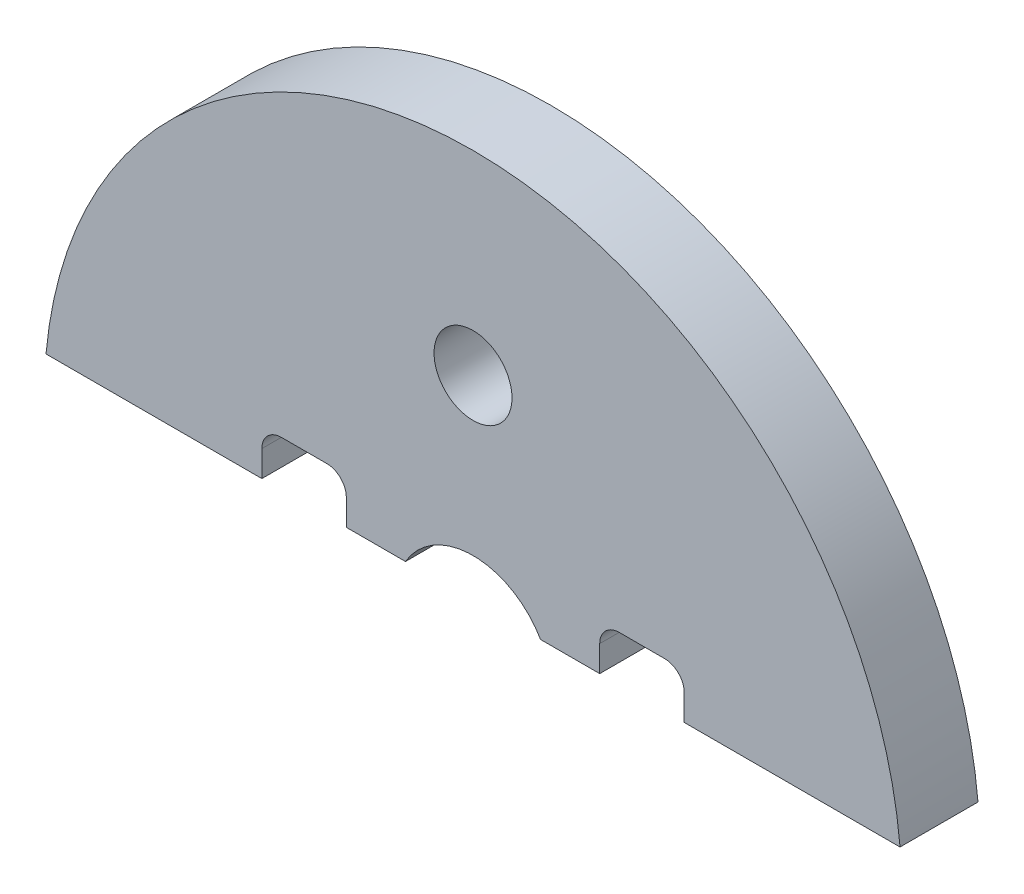
ISO-10303-21;
HEADER;
FILE_DESCRIPTION(('STEP AP214'),'2;1');
FILE_NAME('part.step','',(''),(''),'','','');
FILE_SCHEMA(('AUTOMOTIVE_DESIGN { 1 0 10303 214 1 1 1 1 }'));
ENDSEC;
DATA;
#1=APPLICATION_CONTEXT('core data for automotive mechanical design processes');
#2=APPLICATION_PROTOCOL_DEFINITION('international standard','automotive_design',2000,#1);
#3=PRODUCT_CONTEXT('',#1,'mechanical');
#4=PRODUCT('Part','Part','',(#3));
#5=PRODUCT_RELATED_PRODUCT_CATEGORY('part','',(#4));
#6=PRODUCT_DEFINITION_FORMATION('','',#4);
#7=PRODUCT_DEFINITION_CONTEXT('part definition',#1,'design');
#8=PRODUCT_DEFINITION('design','',#6,#7);
#9=PRODUCT_DEFINITION_SHAPE('','',#8);
#10=(LENGTH_UNIT() NAMED_UNIT(*) SI_UNIT(.MILLI.,.METRE.));
#11=(NAMED_UNIT(*) PLANE_ANGLE_UNIT() SI_UNIT($,.RADIAN.));
#12=(NAMED_UNIT(*) SI_UNIT($,.STERADIAN.) SOLID_ANGLE_UNIT());
#13=UNCERTAINTY_MEASURE_WITH_UNIT(LENGTH_MEASURE(1.E-05),#10,'distance_accuracy_value','');
#14=(GEOMETRIC_REPRESENTATION_CONTEXT(3) GLOBAL_UNCERTAINTY_ASSIGNED_CONTEXT((#13)) GLOBAL_UNIT_ASSIGNED_CONTEXT((#10,
#11,#12)) REPRESENTATION_CONTEXT('',''));
#15=CARTESIAN_POINT('',(0.,0.,0.));
#16=DIRECTION('',(0.,0.,1.));
#17=DIRECTION('',(1.,0.,0.));
#18=AXIS2_PLACEMENT_3D('',#15,#16,#17);
#19=CARTESIAN_POINT('',(221.3728079135,244.4520199932,3.));
#20=DIRECTION('',(0.,0.,1.));
#21=DIRECTION('',(1.,0.,0.));
#22=AXIS2_PLACEMENT_3D('',#19,#20,#21);
#23=PLANE('',#22);
#24=CARTESIAN_POINT('',(221.3728079135,244.4520199932,3.));
#25=DIRECTION('',(0.,0.,-1.));
#26=DIRECTION('',(1.,0.,0.));
#27=AXIS2_PLACEMENT_3D('',#24,#25,#26);
#28=CIRCLE('',#27,0.750000000000001);
#29=CARTESIAN_POINT('',(220.6228079135,244.4520199932,3.));
#30=VERTEX_POINT('',#29);
#31=CARTESIAN_POINT('',(221.3728079135,245.2020199932,3.));
#32=VERTEX_POINT('',#31);
#33=EDGE_CURVE('E209',#30,#32,#28,.T.);
#34=ORIENTED_EDGE('',*,*,#33,.T.);
#35=DIRECTION('',(1.,0.,0.));
#36=VECTOR('',#35,1.);
#37=CARTESIAN_POINT('',(223.1228079135,245.2020199932,3.));
#38=LINE('',#37,#36);
#39=CARTESIAN_POINT('',(223.1228079135,245.2020199932,3.));
#40=VERTEX_POINT('',#39);
#41=EDGE_CURVE('E117',#32,#40,#38,.T.);
#42=ORIENTED_EDGE('',*,*,#41,.T.);
#43=CARTESIAN_POINT('',(223.1228079135,244.4520199932,3.));
#44=DIRECTION('',(0.,0.,-1.));
#45=DIRECTION('',(1.,0.,0.));
#46=AXIS2_PLACEMENT_3D('',#43,#44,#45);
#47=CIRCLE('',#46,0.750000000000001);
#48=CARTESIAN_POINT('',(223.8728079135,244.4520199932,3.));
#49=VERTEX_POINT('',#48);
#50=EDGE_CURVE('E248',#40,#49,#47,.T.);
#51=ORIENTED_EDGE('',*,*,#50,.T.);
#52=DIRECTION('',(0.,-1.,0.));
#53=VECTOR('',#52,1.);
#54=CARTESIAN_POINT('',(223.8728079135,243.4520199932,3.));
#55=LINE('',#54,#53);
#56=CARTESIAN_POINT('',(223.8728079135,243.4520199932,3.));
#57=VERTEX_POINT('',#56);
#58=EDGE_CURVE('E267',#49,#57,#55,.T.);
#59=ORIENTED_EDGE('',*,*,#58,.T.);
#60=DIRECTION('',(1.,0.,0.));
#61=VECTOR('',#60,1.);
#62=CARTESIAN_POINT('',(223.8728079135,243.4520199932,3.));
#63=LINE('',#62,#61);
#64=CARTESIAN_POINT('',(232.1794846387,243.4520199932,3.));
#65=VERTEX_POINT('',#64);
#66=EDGE_CURVE('E264',#57,#65,#63,.T.);
#67=ORIENTED_EDGE('',*,*,#66,.T.);
#68=CARTESIAN_POINT('',(215.74780791355,241.952019993146,3.));
#69=DIRECTION('',(0.,0.,1.));
#70=DIRECTION('',(1.,0.,0.));
#71=AXIS2_PLACEMENT_3D('',#68,#69,#70);
#72=CIRCLE('',#71,16.5);
#73=CARTESIAN_POINT('',(199.3161311884,243.4520199932,3.));
#74=VERTEX_POINT('',#73);
#75=EDGE_CURVE('E266',#65,#74,#72,.T.);
#76=ORIENTED_EDGE('',*,*,#75,.T.);
#77=DIRECTION('',(1.,0.,0.));
#78=VECTOR('',#77,1.);
#79=CARTESIAN_POINT('',(199.3161311884,243.4520199932,3.));
#80=LINE('',#79,#78);
#81=CARTESIAN_POINT('',(207.6228079135,243.4520199932,3.));
#82=VERTEX_POINT('',#81);
#83=EDGE_CURVE('E269',#74,#82,#80,.T.);
#84=ORIENTED_EDGE('',*,*,#83,.T.);
#85=DIRECTION('',(0.,1.,0.));
#86=VECTOR('',#85,1.);
#87=CARTESIAN_POINT('',(207.6228079135,243.4520199932,3.));
#88=LINE('',#87,#86);
#89=CARTESIAN_POINT('',(207.6228079135,244.4520199932,3.));
#90=VERTEX_POINT('',#89);
#91=EDGE_CURVE('E275',#82,#90,#88,.T.);
#92=ORIENTED_EDGE('',*,*,#91,.T.);
#93=CARTESIAN_POINT('',(208.3728079135,244.4520199932,3.));
#94=DIRECTION('',(0.,0.,-1.));
#95=DIRECTION('',(1.,0.,0.));
#96=AXIS2_PLACEMENT_3D('',#93,#94,#95);
#97=CIRCLE('',#96,0.750000000000001);
#98=CARTESIAN_POINT('',(208.3728079135,245.2020199932,3.));
#99=VERTEX_POINT('',#98);
#100=EDGE_CURVE('E277',#90,#99,#97,.T.);
#101=ORIENTED_EDGE('',*,*,#100,.T.);
#102=DIRECTION('',(1.,0.,0.));
#103=VECTOR('',#102,1.);
#104=CARTESIAN_POINT('',(208.3728079135,245.2020199932,3.));
#105=LINE('',#104,#103);
#106=CARTESIAN_POINT('',(210.1228079135,245.2020199932,3.));
#107=VERTEX_POINT('',#106);
#108=EDGE_CURVE('E279',#99,#107,#105,.T.);
#109=ORIENTED_EDGE('',*,*,#108,.T.);
#110=CARTESIAN_POINT('',(210.1228079135,244.4520199932,3.));
#111=DIRECTION('',(0.,0.,-1.));
#112=DIRECTION('',(1.,0.,0.));
#113=AXIS2_PLACEMENT_3D('',#110,#111,#112);
#114=CIRCLE('',#113,0.750000000000001);
#115=CARTESIAN_POINT('',(210.8728079135,244.4520199932,3.));
#116=VERTEX_POINT('',#115);
#117=EDGE_CURVE('E281',#107,#116,#114,.T.);
#118=ORIENTED_EDGE('',*,*,#117,.T.);
#119=DIRECTION('',(0.,-1.,0.));
#120=VECTOR('',#119,1.);
#121=CARTESIAN_POINT('',(210.8728079135,244.4520199932,3.));
#122=LINE('',#121,#120);
#123=CARTESIAN_POINT('',(210.8728079135,243.4520199932,3.));
#124=VERTEX_POINT('',#123);
#125=EDGE_CURVE('E283',#116,#124,#122,.T.);
#126=ORIENTED_EDGE('',*,*,#125,.T.);
#127=DIRECTION('',(1.,0.,0.));
#128=VECTOR('',#127,1.);
#129=CARTESIAN_POINT('',(210.8728079135,243.4520199932,3.));
#130=LINE('',#129,#128);
#131=CARTESIAN_POINT('',(213.1497317022,243.4520199932,3.));
#132=VERTEX_POINT('',#131);
#133=EDGE_CURVE('E160',#124,#132,#130,.T.);
#134=ORIENTED_EDGE('',*,*,#133,.T.);
#135=CARTESIAN_POINT('',(215.74780791355,241.952019993146,3.));
#136=DIRECTION('',(0.,0.,-1.));
#137=DIRECTION('',(1.,0.,0.));
#138=AXIS2_PLACEMENT_3D('',#135,#136,#137);
#139=CIRCLE('',#138,3.0000000000244);
#140=CARTESIAN_POINT('',(218.3458841249,243.4520199932,3.));
#141=VERTEX_POINT('',#140);
#142=EDGE_CURVE('E154',#132,#141,#139,.T.);
#143=ORIENTED_EDGE('',*,*,#142,.T.);
#144=DIRECTION('',(1.,0.,0.));
#145=VECTOR('',#144,1.);
#146=CARTESIAN_POINT('',(218.3458841249,243.4520199932,3.));
#147=LINE('',#146,#145);
#148=CARTESIAN_POINT('',(220.6228079135,243.4520199932,3.));
#149=VERTEX_POINT('',#148);
#150=EDGE_CURVE('E158',#141,#149,#147,.T.);
#151=ORIENTED_EDGE('',*,*,#150,.T.);
#152=DIRECTION('',(0.,1.,0.));
#153=VECTOR('',#152,1.);
#154=CARTESIAN_POINT('',(220.6228079135,244.4520199932,3.));
#155=LINE('',#154,#153);
#156=EDGE_CURVE('E50',#149,#30,#155,.T.);
#157=ORIENTED_EDGE('',*,*,#156,.T.);
#158=EDGE_LOOP('',(#34,#42,#51,#59,#67,#76,#84,#92,#101,#109,#118,#126,#134,#143,#151,#157));
#159=FACE_BOUND('',#158,.T.);
#160=CARTESIAN_POINT('',(215.7478079135,250.9520199932,3.));
#161=DIRECTION('',(0.,0.,1.));
#162=DIRECTION('',(1.,0.,0.));
#163=AXIS2_PLACEMENT_3D('',#160,#161,#162);
#164=CIRCLE('',#163,1.5);
#165=CARTESIAN_POINT('',(217.2478079135,250.9520199932,3.));
#166=VERTEX_POINT('',#165);
#167=EDGE_CURVE('E182',#166,#166,#164,.T.);
#168=ORIENTED_EDGE('',*,*,#167,.F.);
#169=EDGE_LOOP('',(#168));
#170=FACE_BOUND('',#169,.T.);
#171=ADVANCED_FACE('F33',(#159,#170),#23,.T.);
#172=CARTESIAN_POINT('',(221.3728079135,244.4520199932,0.));
#173=DIRECTION('',(0.,0.,1.));
#174=DIRECTION('',(1.,0.,0.));
#175=AXIS2_PLACEMENT_3D('',#172,#173,#174);
#176=PLANE('',#175);
#177=CARTESIAN_POINT('',(221.3728079135,244.4520199932,0.));
#178=DIRECTION('',(0.,0.,-1.));
#179=DIRECTION('',(1.,0.,0.));
#180=AXIS2_PLACEMENT_3D('',#177,#178,#179);
#181=CIRCLE('',#180,0.750000000000001);
#182=CARTESIAN_POINT('',(220.6228079135,244.4520199932,0.));
#183=VERTEX_POINT('',#182);
#184=CARTESIAN_POINT('',(221.3728079135,245.2020199932,0.));
#185=VERTEX_POINT('',#184);
#186=EDGE_CURVE('E178',#183,#185,#181,.T.);
#187=ORIENTED_EDGE('',*,*,#186,.F.);
#188=DIRECTION('',(0.,1.,0.));
#189=VECTOR('',#188,1.);
#190=CARTESIAN_POINT('',(220.6228079135,244.4520199932,0.));
#191=LINE('',#190,#189);
#192=CARTESIAN_POINT('',(220.6228079135,243.4520199932,0.));
#193=VERTEX_POINT('',#192);
#194=EDGE_CURVE('E109',#193,#183,#191,.T.);
#195=ORIENTED_EDGE('',*,*,#194,.F.);
#196=DIRECTION('',(1.,0.,0.));
#197=VECTOR('',#196,1.);
#198=CARTESIAN_POINT('',(218.3458841249,243.4520199932,0.));
#199=LINE('',#198,#197);
#200=CARTESIAN_POINT('',(218.3458841249,243.4520199932,0.));
#201=VERTEX_POINT('',#200);
#202=EDGE_CURVE('E103',#201,#193,#199,.T.);
#203=ORIENTED_EDGE('',*,*,#202,.F.);
#204=CARTESIAN_POINT('',(215.74780791355,241.952019993146,0.));
#205=DIRECTION('',(0.,0.,-1.));
#206=DIRECTION('',(1.,0.,0.));
#207=AXIS2_PLACEMENT_3D('',#204,#205,#206);
#208=CIRCLE('',#207,3.0000000000244);
#209=CARTESIAN_POINT('',(213.1497317022,243.4520199932,0.));
#210=VERTEX_POINT('',#209);
#211=EDGE_CURVE('E168',#210,#201,#208,.T.);
#212=ORIENTED_EDGE('',*,*,#211,.F.);
#213=DIRECTION('',(1.,0.,0.));
#214=VECTOR('',#213,1.);
#215=CARTESIAN_POINT('',(210.8728079135,243.4520199932,0.));
#216=LINE('',#215,#214);
#217=CARTESIAN_POINT('',(210.8728079135,243.4520199932,0.));
#218=VERTEX_POINT('',#217);
#219=EDGE_CURVE('E204',#218,#210,#216,.T.);
#220=ORIENTED_EDGE('',*,*,#219,.F.);
#221=DIRECTION('',(0.,-1.,0.));
#222=VECTOR('',#221,1.);
#223=CARTESIAN_POINT('',(210.8728079135,244.4520199932,0.));
#224=LINE('',#223,#222);
#225=CARTESIAN_POINT('',(210.8728079135,244.4520199932,0.));
#226=VERTEX_POINT('',#225);
#227=EDGE_CURVE('E202',#226,#218,#224,.T.);
#228=ORIENTED_EDGE('',*,*,#227,.F.);
#229=CARTESIAN_POINT('',(210.1228079135,244.4520199932,0.));
#230=DIRECTION('',(0.,0.,-1.));
#231=DIRECTION('',(1.,0.,0.));
#232=AXIS2_PLACEMENT_3D('',#229,#230,#231);
#233=CIRCLE('',#232,0.750000000000001);
#234=CARTESIAN_POINT('',(210.1228079135,245.2020199932,0.));
#235=VERTEX_POINT('',#234);
#236=EDGE_CURVE('E200',#235,#226,#233,.T.);
#237=ORIENTED_EDGE('',*,*,#236,.F.);
#238=DIRECTION('',(1.,0.,0.));
#239=VECTOR('',#238,1.);
#240=CARTESIAN_POINT('',(208.3728079135,245.2020199932,0.));
#241=LINE('',#240,#239);
#242=CARTESIAN_POINT('',(208.3728079135,245.2020199932,0.));
#243=VERTEX_POINT('',#242);
#244=EDGE_CURVE('E198',#243,#235,#241,.T.);
#245=ORIENTED_EDGE('',*,*,#244,.F.);
#246=CARTESIAN_POINT('',(208.3728079135,244.4520199932,0.));
#247=DIRECTION('',(0.,0.,-1.));
#248=DIRECTION('',(1.,0.,0.));
#249=AXIS2_PLACEMENT_3D('',#246,#247,#248);
#250=CIRCLE('',#249,0.750000000000001);
#251=CARTESIAN_POINT('',(207.6228079135,244.4520199932,0.));
#252=VERTEX_POINT('',#251);
#253=EDGE_CURVE('E196',#252,#243,#250,.T.);
#254=ORIENTED_EDGE('',*,*,#253,.F.);
#255=DIRECTION('',(0.,1.,0.));
#256=VECTOR('',#255,1.);
#257=CARTESIAN_POINT('',(207.6228079135,243.4520199932,0.));
#258=LINE('',#257,#256);
#259=CARTESIAN_POINT('',(207.6228079135,243.4520199932,0.));
#260=VERTEX_POINT('',#259);
#261=EDGE_CURVE('E194',#260,#252,#258,.T.);
#262=ORIENTED_EDGE('',*,*,#261,.F.);
#263=DIRECTION('',(1.,0.,0.));
#264=VECTOR('',#263,1.);
#265=CARTESIAN_POINT('',(199.3161311884,243.4520199932,0.));
#266=LINE('',#265,#264);
#267=CARTESIAN_POINT('',(199.3161311884,243.4520199932,0.));
#268=VERTEX_POINT('',#267);
#269=EDGE_CURVE('E192',#268,#260,#266,.T.);
#270=ORIENTED_EDGE('',*,*,#269,.F.);
#271=CARTESIAN_POINT('',(215.74780791355,241.952019993146,0.));
#272=DIRECTION('',(0.,0.,1.));
#273=DIRECTION('',(1.,0.,0.));
#274=AXIS2_PLACEMENT_3D('',#271,#272,#273);
#275=CIRCLE('',#274,16.5);
#276=CARTESIAN_POINT('',(232.1794846387,243.4520199932,0.));
#277=VERTEX_POINT('',#276);
#278=EDGE_CURVE('E190',#277,#268,#275,.T.);
#279=ORIENTED_EDGE('',*,*,#278,.F.);
#280=DIRECTION('',(1.,0.,0.));
#281=VECTOR('',#280,1.);
#282=CARTESIAN_POINT('',(223.8728079135,243.4520199932,0.));
#283=LINE('',#282,#281);
#284=CARTESIAN_POINT('',(223.8728079135,243.4520199932,0.));
#285=VERTEX_POINT('',#284);
#286=EDGE_CURVE('E188',#285,#277,#283,.T.);
#287=ORIENTED_EDGE('',*,*,#286,.F.);
#288=DIRECTION('',(0.,-1.,0.));
#289=VECTOR('',#288,1.);
#290=CARTESIAN_POINT('',(223.8728079135,243.4520199932,0.));
#291=LINE('',#290,#289);
#292=CARTESIAN_POINT('',(223.8728079135,244.4520199932,0.));
#293=VERTEX_POINT('',#292);
#294=EDGE_CURVE('E186',#293,#285,#291,.T.);
#295=ORIENTED_EDGE('',*,*,#294,.F.);
#296=CARTESIAN_POINT('',(223.1228079135,244.4520199932,0.));
#297=DIRECTION('',(0.,0.,-1.));
#298=DIRECTION('',(1.,0.,0.));
#299=AXIS2_PLACEMENT_3D('',#296,#297,#298);
#300=CIRCLE('',#299,0.750000000000001);
#301=CARTESIAN_POINT('',(223.1228079135,245.2020199932,0.));
#302=VERTEX_POINT('',#301);
#303=EDGE_CURVE('E184',#302,#293,#300,.T.);
#304=ORIENTED_EDGE('',*,*,#303,.F.);
#305=DIRECTION('',(1.,0.,0.));
#306=VECTOR('',#305,1.);
#307=CARTESIAN_POINT('',(223.1228079135,245.2020199932,0.));
#308=LINE('',#307,#306);
#309=EDGE_CURVE('E181',#185,#302,#308,.T.);
#310=ORIENTED_EDGE('',*,*,#309,.F.);
#311=EDGE_LOOP('',(#187,#195,#203,#212,#220,#228,#237,#245,#254,#262,#270,#279,#287,#295,#304,#310));
#312=FACE_BOUND('',#311,.T.);
#313=CARTESIAN_POINT('',(215.7478079135,250.9520199932,0.));
#314=DIRECTION('',(0.,0.,1.));
#315=DIRECTION('',(1.,0.,0.));
#316=AXIS2_PLACEMENT_3D('',#313,#314,#315);
#317=CIRCLE('',#316,1.5);
#318=CARTESIAN_POINT('',(217.2478079135,250.9520199932,0.));
#319=VERTEX_POINT('',#318);
#320=EDGE_CURVE('E482',#319,#319,#317,.T.);
#321=ORIENTED_EDGE('',*,*,#320,.T.);
#322=EDGE_LOOP('',(#321));
#323=FACE_BOUND('',#322,.T.);
#324=ADVANCED_FACE('F252',(#312,#323),#176,.F.);
#325=CARTESIAN_POINT('',(221.3728079135,244.4520199932,3.));
#326=DIRECTION('',(0.,0.,-1.));
#327=DIRECTION('',(-1.,0.,0.));
#328=AXIS2_PLACEMENT_3D('',#325,#326,#327);
#329=CYLINDRICAL_SURFACE('',#328,0.750000000000001);
#330=ORIENTED_EDGE('',*,*,#186,.T.);
#331=DIRECTION('',(0.,0.,-1.));
#332=VECTOR('',#331,1.);
#333=CARTESIAN_POINT('',(221.3728079135,245.2020199932,3.));
#334=LINE('',#333,#332);
#335=EDGE_CURVE('E11',#32,#185,#334,.T.);
#336=ORIENTED_EDGE('',*,*,#335,.F.);
#337=ORIENTED_EDGE('',*,*,#33,.F.);
#338=DIRECTION('',(0.,0.,-1.));
#339=VECTOR('',#338,1.);
#340=CARTESIAN_POINT('',(220.6228079135,244.4520199932,3.));
#341=LINE('',#340,#339);
#342=EDGE_CURVE('E174',#30,#183,#341,.T.);
#343=ORIENTED_EDGE('',*,*,#342,.T.);
#344=EDGE_LOOP('',(#330,#336,#337,#343));
#345=FACE_BOUND('',#344,.T.);
#346=ADVANCED_FACE('F35',(#345),#329,.F.);
#347=CARTESIAN_POINT('',(223.1228079135,245.2020199932,3.));
#348=DIRECTION('',(0.,1.,0.));
#349=DIRECTION('',(0.,0.,1.));
#350=AXIS2_PLACEMENT_3D('',#347,#348,#349);
#351=PLANE('',#350);
#352=ORIENTED_EDGE('',*,*,#309,.T.);
#353=DIRECTION('',(0.,0.,-1.));
#354=VECTOR('',#353,1.);
#355=CARTESIAN_POINT('',(223.1228079135,245.2020199932,3.));
#356=LINE('',#355,#354);
#357=EDGE_CURVE('E42',#40,#302,#356,.T.);
#358=ORIENTED_EDGE('',*,*,#357,.F.);
#359=ORIENTED_EDGE('',*,*,#41,.F.);
#360=ORIENTED_EDGE('',*,*,#335,.T.);
#361=EDGE_LOOP('',(#352,#358,#359,#360));
#362=FACE_BOUND('',#361,.T.);
#363=ADVANCED_FACE('F317',(#362),#351,.F.);
#364=CARTESIAN_POINT('',(223.1228079135,244.4520199932,3.));
#365=DIRECTION('',(0.,0.,-1.));
#366=DIRECTION('',(-1.,0.,0.));
#367=AXIS2_PLACEMENT_3D('',#364,#365,#366);
#368=CYLINDRICAL_SURFACE('',#367,0.750000000000001);
#369=ORIENTED_EDGE('',*,*,#303,.T.);
#370=DIRECTION('',(0.,0.,-1.));
#371=VECTOR('',#370,1.);
#372=CARTESIAN_POINT('',(223.8728079135,244.4520199932,3.));
#373=LINE('',#372,#371);
#374=EDGE_CURVE('E240',#49,#293,#373,.T.);
#375=ORIENTED_EDGE('',*,*,#374,.F.);
#376=ORIENTED_EDGE('',*,*,#50,.F.);
#377=ORIENTED_EDGE('',*,*,#357,.T.);
#378=EDGE_LOOP('',(#369,#375,#376,#377));
#379=FACE_BOUND('',#378,.T.);
#380=ADVANCED_FACE('F246',(#379),#368,.F.);
#381=CARTESIAN_POINT('',(223.8728079135,243.4520199932,3.));
#382=DIRECTION('',(1.,0.,0.));
#383=DIRECTION('',(0.,0.,-1.));
#384=AXIS2_PLACEMENT_3D('',#381,#382,#383);
#385=PLANE('',#384);
#386=ORIENTED_EDGE('',*,*,#294,.T.);
#387=DIRECTION('',(0.,0.,-1.));
#388=VECTOR('',#387,1.);
#389=CARTESIAN_POINT('',(223.8728079135,243.4520199932,3.));
#390=LINE('',#389,#388);
#391=EDGE_CURVE('E237',#57,#285,#390,.T.);
#392=ORIENTED_EDGE('',*,*,#391,.F.);
#393=ORIENTED_EDGE('',*,*,#58,.F.);
#394=ORIENTED_EDGE('',*,*,#374,.T.);
#395=EDGE_LOOP('',(#386,#392,#393,#394));
#396=FACE_BOUND('',#395,.T.);
#397=ADVANCED_FACE('F258',(#396),#385,.F.);
#398=CARTESIAN_POINT('',(223.8728079135,243.4520199932,3.));
#399=DIRECTION('',(0.,1.,0.));
#400=DIRECTION('',(0.,0.,1.));
#401=AXIS2_PLACEMENT_3D('',#398,#399,#400);
#402=PLANE('',#401);
#403=ORIENTED_EDGE('',*,*,#286,.T.);
#404=DIRECTION('',(0.,0.,-1.));
#405=VECTOR('',#404,1.);
#406=CARTESIAN_POINT('',(232.1794846387,243.4520199932,3.));
#407=LINE('',#406,#405);
#408=EDGE_CURVE('E234',#65,#277,#407,.T.);
#409=ORIENTED_EDGE('',*,*,#408,.F.);
#410=ORIENTED_EDGE('',*,*,#66,.F.);
#411=ORIENTED_EDGE('',*,*,#391,.T.);
#412=EDGE_LOOP('',(#403,#409,#410,#411));
#413=FACE_BOUND('',#412,.T.);
#414=ADVANCED_FACE('F262',(#413),#402,.F.);
#415=CARTESIAN_POINT('',(215.74780791355,241.952019993146,3.));
#416=DIRECTION('',(0.,0.,-1.));
#417=DIRECTION('',(-1.,0.,0.));
#418=AXIS2_PLACEMENT_3D('',#415,#416,#417);
#419=CYLINDRICAL_SURFACE('',#418,16.5);
#420=ORIENTED_EDGE('',*,*,#278,.T.);
#421=DIRECTION('',(0.,0.,-1.));
#422=VECTOR('',#421,1.);
#423=CARTESIAN_POINT('',(199.3161311884,243.4520199932,3.));
#424=LINE('',#423,#422);
#425=EDGE_CURVE('E231',#74,#268,#424,.T.);
#426=ORIENTED_EDGE('',*,*,#425,.F.);
#427=ORIENTED_EDGE('',*,*,#75,.F.);
#428=ORIENTED_EDGE('',*,*,#408,.T.);
#429=EDGE_LOOP('',(#420,#426,#427,#428));
#430=FACE_BOUND('',#429,.T.);
#431=ADVANCED_FACE('F330',(#430),#419,.T.);
#432=CARTESIAN_POINT('',(199.3161311884,243.4520199932,3.));
#433=DIRECTION('',(0.,1.,0.));
#434=DIRECTION('',(0.,0.,1.));
#435=AXIS2_PLACEMENT_3D('',#432,#433,#434);
#436=PLANE('',#435);
#437=ORIENTED_EDGE('',*,*,#269,.T.);
#438=DIRECTION('',(0.,0.,-1.));
#439=VECTOR('',#438,1.);
#440=CARTESIAN_POINT('',(207.6228079135,243.4520199932,3.));
#441=LINE('',#440,#439);
#442=EDGE_CURVE('E228',#82,#260,#441,.T.);
#443=ORIENTED_EDGE('',*,*,#442,.F.);
#444=ORIENTED_EDGE('',*,*,#83,.F.);
#445=ORIENTED_EDGE('',*,*,#425,.T.);
#446=EDGE_LOOP('',(#437,#443,#444,#445));
#447=FACE_BOUND('',#446,.T.);
#448=ADVANCED_FACE('F333',(#447),#436,.F.);
#449=CARTESIAN_POINT('',(207.6228079135,243.4520199932,3.));
#450=DIRECTION('',(-1.,0.,0.));
#451=DIRECTION('',(0.,0.,1.));
#452=AXIS2_PLACEMENT_3D('',#449,#450,#451);
#453=PLANE('',#452);
#454=ORIENTED_EDGE('',*,*,#261,.T.);
#455=DIRECTION('',(0.,0.,-1.));
#456=VECTOR('',#455,1.);
#457=CARTESIAN_POINT('',(207.6228079135,244.4520199932,3.));
#458=LINE('',#457,#456);
#459=EDGE_CURVE('E225',#90,#252,#458,.T.);
#460=ORIENTED_EDGE('',*,*,#459,.F.);
#461=ORIENTED_EDGE('',*,*,#91,.F.);
#462=ORIENTED_EDGE('',*,*,#442,.T.);
#463=EDGE_LOOP('',(#454,#460,#461,#462));
#464=FACE_BOUND('',#463,.T.);
#465=ADVANCED_FACE('F337',(#464),#453,.F.);
#466=CARTESIAN_POINT('',(208.3728079135,244.4520199932,3.));
#467=DIRECTION('',(0.,0.,-1.));
#468=DIRECTION('',(-1.,0.,0.));
#469=AXIS2_PLACEMENT_3D('',#466,#467,#468);
#470=CYLINDRICAL_SURFACE('',#469,0.750000000000001);
#471=ORIENTED_EDGE('',*,*,#253,.T.);
#472=DIRECTION('',(0.,0.,-1.));
#473=VECTOR('',#472,1.);
#474=CARTESIAN_POINT('',(208.3728079135,245.2020199932,3.));
#475=LINE('',#474,#473);
#476=EDGE_CURVE('E222',#99,#243,#475,.T.);
#477=ORIENTED_EDGE('',*,*,#476,.F.);
#478=ORIENTED_EDGE('',*,*,#100,.F.);
#479=ORIENTED_EDGE('',*,*,#459,.T.);
#480=EDGE_LOOP('',(#471,#477,#478,#479));
#481=FACE_BOUND('',#480,.T.);
#482=ADVANCED_FACE('F341',(#481),#470,.F.);
#483=CARTESIAN_POINT('',(208.3728079135,245.2020199932,3.));
#484=DIRECTION('',(0.,1.,0.));
#485=DIRECTION('',(0.,0.,1.));
#486=AXIS2_PLACEMENT_3D('',#483,#484,#485);
#487=PLANE('',#486);
#488=ORIENTED_EDGE('',*,*,#244,.T.);
#489=DIRECTION('',(0.,0.,-1.));
#490=VECTOR('',#489,1.);
#491=CARTESIAN_POINT('',(210.1228079135,245.2020199932,3.));
#492=LINE('',#491,#490);
#493=EDGE_CURVE('E219',#107,#235,#492,.T.);
#494=ORIENTED_EDGE('',*,*,#493,.F.);
#495=ORIENTED_EDGE('',*,*,#108,.F.);
#496=ORIENTED_EDGE('',*,*,#476,.T.);
#497=EDGE_LOOP('',(#488,#494,#495,#496));
#498=FACE_BOUND('',#497,.T.);
#499=ADVANCED_FACE('F345',(#498),#487,.F.);
#500=CARTESIAN_POINT('',(210.1228079135,244.4520199932,3.));
#501=DIRECTION('',(0.,0.,-1.));
#502=DIRECTION('',(-1.,0.,0.));
#503=AXIS2_PLACEMENT_3D('',#500,#501,#502);
#504=CYLINDRICAL_SURFACE('',#503,0.750000000000001);
#505=ORIENTED_EDGE('',*,*,#236,.T.);
#506=DIRECTION('',(0.,0.,-1.));
#507=VECTOR('',#506,1.);
#508=CARTESIAN_POINT('',(210.8728079135,244.4520199932,3.));
#509=LINE('',#508,#507);
#510=EDGE_CURVE('E216',#116,#226,#509,.T.);
#511=ORIENTED_EDGE('',*,*,#510,.F.);
#512=ORIENTED_EDGE('',*,*,#117,.F.);
#513=ORIENTED_EDGE('',*,*,#493,.T.);
#514=EDGE_LOOP('',(#505,#511,#512,#513));
#515=FACE_BOUND('',#514,.T.);
#516=ADVANCED_FACE('F349',(#515),#504,.F.);
#517=CARTESIAN_POINT('',(210.8728079135,244.4520199932,3.));
#518=DIRECTION('',(1.,0.,0.));
#519=DIRECTION('',(0.,0.,-1.));
#520=AXIS2_PLACEMENT_3D('',#517,#518,#519);
#521=PLANE('',#520);
#522=ORIENTED_EDGE('',*,*,#227,.T.);
#523=DIRECTION('',(0.,0.,-1.));
#524=VECTOR('',#523,1.);
#525=CARTESIAN_POINT('',(210.8728079135,243.4520199932,3.));
#526=LINE('',#525,#524);
#527=EDGE_CURVE('E213',#124,#218,#526,.T.);
#528=ORIENTED_EDGE('',*,*,#527,.F.);
#529=ORIENTED_EDGE('',*,*,#125,.F.);
#530=ORIENTED_EDGE('',*,*,#510,.T.);
#531=EDGE_LOOP('',(#522,#528,#529,#530));
#532=FACE_BOUND('',#531,.T.);
#533=ADVANCED_FACE('F289',(#532),#521,.F.);
#534=CARTESIAN_POINT('',(210.8728079135,243.4520199932,3.));
#535=DIRECTION('',(0.,1.,0.));
#536=DIRECTION('',(0.,0.,1.));
#537=AXIS2_PLACEMENT_3D('',#534,#535,#536);
#538=PLANE('',#537);
#539=ORIENTED_EDGE('',*,*,#219,.T.);
#540=DIRECTION('',(0.,0.,-1.));
#541=VECTOR('',#540,1.);
#542=CARTESIAN_POINT('',(213.1497317022,243.4520199932,3.));
#543=LINE('',#542,#541);
#544=EDGE_CURVE('E169',#132,#210,#543,.T.);
#545=ORIENTED_EDGE('',*,*,#544,.F.);
#546=ORIENTED_EDGE('',*,*,#133,.F.);
#547=ORIENTED_EDGE('',*,*,#527,.T.);
#548=EDGE_LOOP('',(#539,#545,#546,#547));
#549=FACE_BOUND('',#548,.T.);
#550=ADVANCED_FACE('F293',(#549),#538,.F.);
#551=CARTESIAN_POINT('',(215.74780791355,241.952019993146,3.));
#552=DIRECTION('',(0.,0.,-1.));
#553=DIRECTION('',(-1.,0.,0.));
#554=AXIS2_PLACEMENT_3D('',#551,#552,#553);
#555=CYLINDRICAL_SURFACE('',#554,3.0000000000244);
#556=ORIENTED_EDGE('',*,*,#211,.T.);
#557=DIRECTION('',(0.,0.,-1.));
#558=VECTOR('',#557,1.);
#559=CARTESIAN_POINT('',(218.3458841249,243.4520199932,3.));
#560=LINE('',#559,#558);
#561=EDGE_CURVE('E165',#141,#201,#560,.T.);
#562=ORIENTED_EDGE('',*,*,#561,.F.);
#563=ORIENTED_EDGE('',*,*,#142,.F.);
#564=ORIENTED_EDGE('',*,*,#544,.T.);
#565=EDGE_LOOP('',(#556,#562,#563,#564));
#566=FACE_BOUND('',#565,.T.);
#567=ADVANCED_FACE('F166',(#566),#555,.F.);
#568=CARTESIAN_POINT('',(218.3458841249,243.4520199932,3.));
#569=DIRECTION('',(0.,1.,0.));
#570=DIRECTION('',(0.,0.,1.));
#571=AXIS2_PLACEMENT_3D('',#568,#569,#570);
#572=PLANE('',#571);
#573=ORIENTED_EDGE('',*,*,#202,.T.);
#574=DIRECTION('',(0.,0.,-1.));
#575=VECTOR('',#574,1.);
#576=CARTESIAN_POINT('',(220.6228079135,243.4520199932,3.));
#577=LINE('',#576,#575);
#578=EDGE_CURVE('E170',#149,#193,#577,.T.);
#579=ORIENTED_EDGE('',*,*,#578,.F.);
#580=ORIENTED_EDGE('',*,*,#150,.F.);
#581=ORIENTED_EDGE('',*,*,#561,.T.);
#582=EDGE_LOOP('',(#573,#579,#580,#581));
#583=FACE_BOUND('',#582,.T.);
#584=ADVANCED_FACE('F172',(#583),#572,.F.);
#585=CARTESIAN_POINT('',(220.6228079135,244.4520199932,3.));
#586=DIRECTION('',(-1.,0.,0.));
#587=DIRECTION('',(0.,0.,1.));
#588=AXIS2_PLACEMENT_3D('',#585,#586,#587);
#589=PLANE('',#588);
#590=ORIENTED_EDGE('',*,*,#194,.T.);
#591=ORIENTED_EDGE('',*,*,#342,.F.);
#592=ORIENTED_EDGE('',*,*,#156,.F.);
#593=ORIENTED_EDGE('',*,*,#578,.T.);
#594=EDGE_LOOP('',(#590,#591,#592,#593));
#595=FACE_BOUND('',#594,.T.);
#596=ADVANCED_FACE('F297',(#595),#589,.F.);
#597=CARTESIAN_POINT('',(215.7478079135,250.9520199932,3.));
#598=DIRECTION('',(0.,0.,-1.));
#599=DIRECTION('',(-1.,0.,0.));
#600=AXIS2_PLACEMENT_3D('',#597,#598,#599);
#601=CYLINDRICAL_SURFACE('',#600,1.5);
#602=ORIENTED_EDGE('',*,*,#167,.T.);
#603=EDGE_LOOP('',(#602));
#604=FACE_BOUND('',#603,.T.);
#605=ORIENTED_EDGE('',*,*,#320,.F.);
#606=EDGE_LOOP('',(#605));
#607=FACE_BOUND('',#606,.T.);
#608=ADVANCED_FACE('F299',(#604,#607),#601,.F.);
#609=CLOSED_SHELL('',(#171,#324,#346,#363,#380,#397,#414,#431,#448,#465,#482,#499,#516,#533,
#550,#567,#584,#596,#608));
#610=MANIFOLD_SOLID_BREP('B2',#609);
#611=ADVANCED_BREP_SHAPE_REPRESENTATION('',(#18,#610),#14);
#612=SHAPE_DEFINITION_REPRESENTATION(#9,#611);
ENDSEC;
END-ISO-10303-21;
